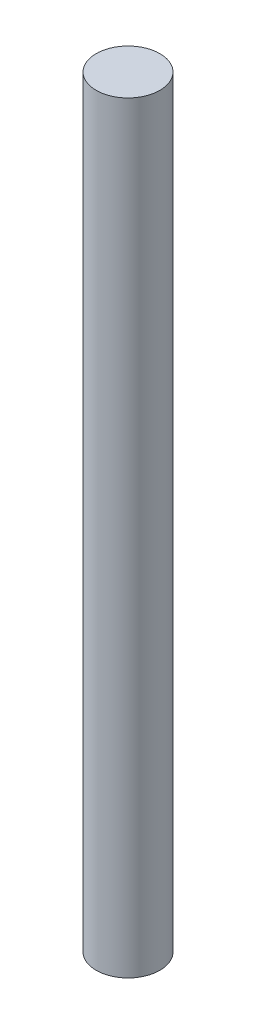
ISO-10303-21;
HEADER;
FILE_DESCRIPTION(('STEP AP214'),'2;1');
FILE_NAME('part.step','',(''),(''),'','','');
FILE_SCHEMA(('AUTOMOTIVE_DESIGN { 1 0 10303 214 1 1 1 1 }'));
ENDSEC;
DATA;
#1=APPLICATION_CONTEXT('core data for automotive mechanical design processes');
#2=APPLICATION_PROTOCOL_DEFINITION('international standard','automotive_design',2000,#1);
#3=PRODUCT_CONTEXT('',#1,'mechanical');
#4=PRODUCT('Part','Part','',(#3));
#5=PRODUCT_RELATED_PRODUCT_CATEGORY('part','',(#4));
#6=PRODUCT_DEFINITION_FORMATION('','',#4);
#7=PRODUCT_DEFINITION_CONTEXT('part definition',#1,'design');
#8=PRODUCT_DEFINITION('design','',#6,#7);
#9=PRODUCT_DEFINITION_SHAPE('','',#8);
#10=(LENGTH_UNIT() NAMED_UNIT(*) SI_UNIT(.MILLI.,.METRE.));
#11=(NAMED_UNIT(*) PLANE_ANGLE_UNIT() SI_UNIT($,.RADIAN.));
#12=(NAMED_UNIT(*) SI_UNIT($,.STERADIAN.) SOLID_ANGLE_UNIT());
#13=UNCERTAINTY_MEASURE_WITH_UNIT(LENGTH_MEASURE(1.E-05),#10,'distance_accuracy_value','');
#14=(GEOMETRIC_REPRESENTATION_CONTEXT(3) GLOBAL_UNCERTAINTY_ASSIGNED_CONTEXT((#13)) GLOBAL_UNIT_ASSIGNED_CONTEXT((#10,
#11,#12)) REPRESENTATION_CONTEXT('',''));
#15=CARTESIAN_POINT('',(0.,0.,0.));
#16=DIRECTION('',(0.,0.,1.));
#17=DIRECTION('',(1.,0.,0.));
#18=AXIS2_PLACEMENT_3D('',#15,#16,#17);
#19=CARTESIAN_POINT('',(0.,114.,0.));
#20=DIRECTION('',(0.,-1.,0.));
#21=DIRECTION('',(0.,0.,-1.));
#22=AXIS2_PLACEMENT_3D('',#19,#20,#21);
#23=CYLINDRICAL_SURFACE('',#22,4.7625);
#24=CARTESIAN_POINT('',(0.,114.,0.));
#25=DIRECTION('',(0.,1.,0.));
#26=DIRECTION('',(0.,0.,1.));
#27=AXIS2_PLACEMENT_3D('',#24,#25,#26);
#28=CIRCLE('',#27,4.7625);
#29=CARTESIAN_POINT('',(0.,114.,-4.7625));
#30=VERTEX_POINT('',#29);
#31=EDGE_CURVE('E10',#30,#30,#28,.T.);
#32=CARTESIAN_POINT('',(0.,0.,0.));
#33=DIRECTION('',(0.,1.,0.));
#34=DIRECTION('',(0.,0.,1.));
#35=AXIS2_PLACEMENT_3D('',#32,#33,#34);
#36=CIRCLE('',#35,4.7625);
#37=CARTESIAN_POINT('',(0.,0.,-4.7625));
#38=VERTEX_POINT('',#37);
#39=EDGE_CURVE('E42',#38,#38,#36,.T.);
#40=CARTESIAN_POINT('',(0.,114.,-4.7625));
#41=CARTESIAN_POINT('',(0.,112.8125,-4.7625));
#42=CARTESIAN_POINT('',(0.,111.625,-4.7625));
#43=CARTESIAN_POINT('',(0.,109.25,-4.7625));
#44=CARTESIAN_POINT('',(0.,108.0625,-4.7625));
#45=CARTESIAN_POINT('',(0.,105.6875,-4.7625));
#46=CARTESIAN_POINT('',(0.,104.5,-4.7625));
#47=CARTESIAN_POINT('',(0.,102.125,-4.7625));
#48=CARTESIAN_POINT('',(0.,100.9375,-4.7625));
#49=CARTESIAN_POINT('',(0.,98.5625,-4.7625));
#50=CARTESIAN_POINT('',(0.,97.375,-4.7625));
#51=CARTESIAN_POINT('',(0.,95.,-4.7625));
#52=CARTESIAN_POINT('',(0.,93.8125,-4.7625));
#53=CARTESIAN_POINT('',(0.,91.4375,-4.7625));
#54=CARTESIAN_POINT('',(0.,90.25,-4.7625));
#55=CARTESIAN_POINT('',(0.,87.875,-4.7625));
#56=CARTESIAN_POINT('',(0.,86.6875,-4.7625));
#57=CARTESIAN_POINT('',(0.,84.3125,-4.7625));
#58=CARTESIAN_POINT('',(0.,83.125,-4.7625));
#59=CARTESIAN_POINT('',(0.,80.75,-4.7625));
#60=CARTESIAN_POINT('',(0.,79.5625,-4.7625));
#61=CARTESIAN_POINT('',(0.,77.1875,-4.7625));
#62=CARTESIAN_POINT('',(0.,76.,-4.7625));
#63=CARTESIAN_POINT('',(0.,73.625,-4.7625));
#64=CARTESIAN_POINT('',(0.,72.4375,-4.7625));
#65=CARTESIAN_POINT('',(0.,70.0625,-4.7625));
#66=CARTESIAN_POINT('',(0.,68.875,-4.7625));
#67=CARTESIAN_POINT('',(0.,66.5,-4.7625));
#68=CARTESIAN_POINT('',(0.,65.3125,-4.7625));
#69=CARTESIAN_POINT('',(0.,62.9375,-4.7625));
#70=CARTESIAN_POINT('',(0.,61.75,-4.7625));
#71=CARTESIAN_POINT('',(0.,59.375,-4.7625));
#72=CARTESIAN_POINT('',(0.,58.1875,-4.7625));
#73=CARTESIAN_POINT('',(0.,55.8125,-4.7625));
#74=CARTESIAN_POINT('',(0.,54.625,-4.7625));
#75=CARTESIAN_POINT('',(0.,52.25,-4.7625));
#76=CARTESIAN_POINT('',(0.,51.0625,-4.7625));
#77=CARTESIAN_POINT('',(0.,48.6875,-4.7625));
#78=CARTESIAN_POINT('',(0.,47.5,-4.7625));
#79=CARTESIAN_POINT('',(0.,45.125,-4.7625));
#80=CARTESIAN_POINT('',(0.,43.9375,-4.7625));
#81=CARTESIAN_POINT('',(0.,41.5625,-4.7625));
#82=CARTESIAN_POINT('',(0.,40.375,-4.7625));
#83=CARTESIAN_POINT('',(0.,38.,-4.7625));
#84=CARTESIAN_POINT('',(0.,36.8125,-4.7625));
#85=CARTESIAN_POINT('',(0.,34.4375,-4.7625));
#86=CARTESIAN_POINT('',(0.,33.25,-4.7625));
#87=CARTESIAN_POINT('',(0.,30.875,-4.7625));
#88=CARTESIAN_POINT('',(0.,29.6875,-4.7625));
#89=CARTESIAN_POINT('',(0.,27.3125,-4.7625));
#90=CARTESIAN_POINT('',(0.,26.125,-4.7625));
#91=CARTESIAN_POINT('',(0.,23.75,-4.7625));
#92=CARTESIAN_POINT('',(0.,22.5625,-4.7625));
#93=CARTESIAN_POINT('',(0.,20.1875,-4.7625));
#94=CARTESIAN_POINT('',(0.,19.,-4.7625));
#95=CARTESIAN_POINT('',(0.,16.625,-4.7625));
#96=CARTESIAN_POINT('',(0.,15.4375,-4.7625));
#97=CARTESIAN_POINT('',(0.,13.0625,-4.7625));
#98=CARTESIAN_POINT('',(0.,11.875,-4.7625));
#99=CARTESIAN_POINT('',(0.,9.5,-4.7625));
#100=CARTESIAN_POINT('',(0.,8.31250000000001,-4.7625));
#101=CARTESIAN_POINT('',(0.,5.9375,-4.7625));
#102=CARTESIAN_POINT('',(0.,4.75,-4.7625));
#103=CARTESIAN_POINT('',(0.,2.375,-4.7625));
#104=CARTESIAN_POINT('',(0.,1.1875,-4.7625));
#105=CARTESIAN_POINT('',(0.,0.,-4.7625));
#106=B_SPLINE_CURVE_WITH_KNOTS('',3,(#40,#41,#42,#43,#44,#45,#46,#47,#48,#49,#50,#51,#52,#53,
#54,#55,#56,#57,#58,#59,#60,#61,#62,#63,#64,#65,#66,#67,#68,#69,#70,#71,#72,#73,#74,#75,#76,#77,
#78,#79,#80,#81,#82,#83,#84,#85,#86,#87,#88,#89,#90,#91,#92,#93,#94,#95,#96,#97,#98,#99,#100,
#101,#102,#103,#104,#105),.UNSPECIFIED.,.F.,.F.,(4,2,2,2,2,2,2,2,2,2,2,2,2,2,2,2,2,2,2,2,2,2,2,
2,2,2,2,2,2,2,2,2,4),(0.,3.5625,7.12499999999999,10.6875,14.25,17.8125,21.375,24.9375,28.5,
32.0625,35.625,39.1875,42.75,46.3125,49.875,53.4375,57.,60.5625,64.125,67.6875,71.25,74.8125,
78.375,81.9375,85.5,89.0625,92.625,96.1875,99.75,103.3125,106.875,110.4375,114.),.UNSPECIFIED.);
#107=EDGE_CURVE('BSEAM39',#30,#38,#106,.T.);
#108=ORIENTED_EDGE('',*,*,#31,.F.);
#109=ORIENTED_EDGE('',*,*,#39,.T.);
#110=ORIENTED_EDGE('',*,*,#107,.T.);
#111=ORIENTED_EDGE('',*,*,#107,.F.);
#112=EDGE_LOOP('',(#108,#110,#109,#111));
#113=FACE_BOUND('',#112,.T.);
#114=ADVANCED_FACE('F39',(#113),#23,.T.);
#115=CARTESIAN_POINT('',(0.,114.,0.));
#116=DIRECTION('',(0.,1.,0.));
#117=DIRECTION('',(0.,0.,1.));
#118=AXIS2_PLACEMENT_3D('',#115,#116,#117);
#119=PLANE('',#118);
#120=ORIENTED_EDGE('',*,*,#31,.T.);
#121=EDGE_LOOP('',(#120));
#122=FACE_BOUND('',#121,.T.);
#123=ADVANCED_FACE('F54',(#122),#119,.T.);
#124=CARTESIAN_POINT('',(0.,0.,0.));
#125=DIRECTION('',(0.,1.,0.));
#126=DIRECTION('',(0.,0.,1.));
#127=AXIS2_PLACEMENT_3D('',#124,#125,#126);
#128=PLANE('',#127);
#129=ORIENTED_EDGE('',*,*,#39,.F.);
#130=EDGE_LOOP('',(#129));
#131=FACE_BOUND('',#130,.T.);
#132=ADVANCED_FACE('F52',(#131),#128,.F.);
#133=CLOSED_SHELL('',(#114,#123,#132));
#134=MANIFOLD_SOLID_BREP('B2',#133);
#135=ADVANCED_BREP_SHAPE_REPRESENTATION('',(#18,#134),#14);
#136=SHAPE_DEFINITION_REPRESENTATION(#9,#135);
ENDSEC;
END-ISO-10303-21;
